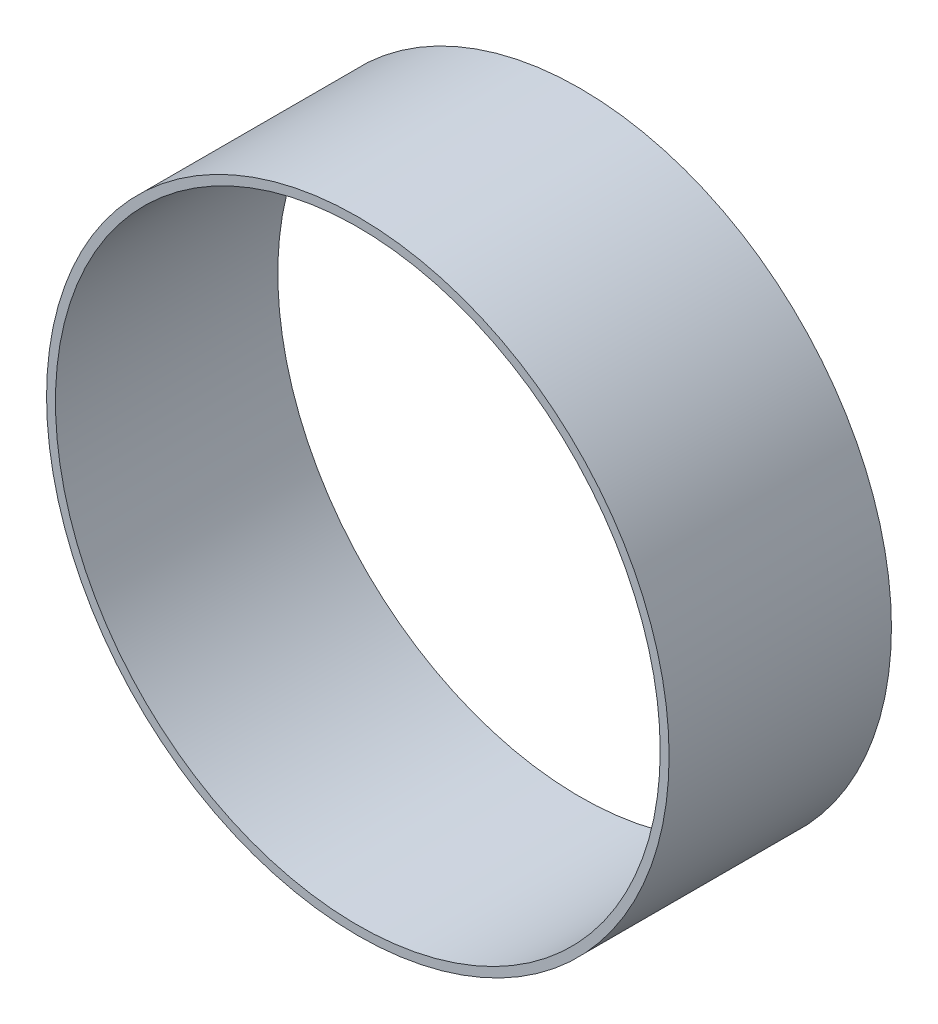
ISO-10303-21;
HEADER;
FILE_DESCRIPTION(('STEP AP214'),'2;1');
FILE_NAME('part.step','',(''),(''),'','','');
FILE_SCHEMA(('AUTOMOTIVE_DESIGN { 1 0 10303 214 1 1 1 1 }'));
ENDSEC;
DATA;
#1=APPLICATION_CONTEXT('core data for automotive mechanical design processes');
#2=APPLICATION_PROTOCOL_DEFINITION('international standard','automotive_design',2000,#1);
#3=PRODUCT_CONTEXT('',#1,'mechanical');
#4=PRODUCT('Part','Part','',(#3));
#5=PRODUCT_RELATED_PRODUCT_CATEGORY('part','',(#4));
#6=PRODUCT_DEFINITION_FORMATION('','',#4);
#7=PRODUCT_DEFINITION_CONTEXT('part definition',#1,'design');
#8=PRODUCT_DEFINITION('design','',#6,#7);
#9=PRODUCT_DEFINITION_SHAPE('','',#8);
#10=(LENGTH_UNIT() NAMED_UNIT(*) SI_UNIT(.MILLI.,.METRE.));
#11=(NAMED_UNIT(*) PLANE_ANGLE_UNIT() SI_UNIT($,.RADIAN.));
#12=(NAMED_UNIT(*) SI_UNIT($,.STERADIAN.) SOLID_ANGLE_UNIT());
#13=UNCERTAINTY_MEASURE_WITH_UNIT(LENGTH_MEASURE(1.E-05),#10,'distance_accuracy_value','');
#14=(GEOMETRIC_REPRESENTATION_CONTEXT(3) GLOBAL_UNCERTAINTY_ASSIGNED_CONTEXT((#13)) GLOBAL_UNIT_ASSIGNED_CONTEXT((#10,
#11,#12)) REPRESENTATION_CONTEXT('',''));
#15=CARTESIAN_POINT('',(0.,0.,0.));
#16=DIRECTION('',(0.,0.,1.));
#17=DIRECTION('',(1.,0.,0.));
#18=AXIS2_PLACEMENT_3D('',#15,#16,#17);
#19=CARTESIAN_POINT('',(0.,0.,0.));
#20=DIRECTION('',(0.,0.,1.));
#21=DIRECTION('',(1.,0.,0.));
#22=AXIS2_PLACEMENT_3D('',#19,#20,#21);
#23=CYLINDRICAL_SURFACE('',#22,68.);
#24=CARTESIAN_POINT('',(0.,0.,-50.));
#25=DIRECTION('',(0.,0.,1.));
#26=DIRECTION('',(1.,0.,0.));
#27=AXIS2_PLACEMENT_3D('',#24,#25,#26);
#28=CIRCLE('',#27,68.);
#29=CARTESIAN_POINT('',(68.,0.,-50.));
#30=VERTEX_POINT('',#29);
#31=EDGE_CURVE('E56',#30,#30,#28,.T.);
#32=ORIENTED_EDGE('',*,*,#31,.F.);
#33=EDGE_LOOP('',(#32));
#34=FACE_BOUND('',#33,.T.);
#35=CARTESIAN_POINT('',(0.,0.,0.));
#36=DIRECTION('',(0.,0.,1.));
#37=DIRECTION('',(1.,0.,0.));
#38=AXIS2_PLACEMENT_3D('',#35,#36,#37);
#39=CIRCLE('',#38,68.);
#40=CARTESIAN_POINT('',(68.,0.,0.));
#41=VERTEX_POINT('',#40);
#42=EDGE_CURVE('E12',#41,#41,#39,.T.);
#43=ORIENTED_EDGE('',*,*,#42,.T.);
#44=EDGE_LOOP('',(#43));
#45=FACE_BOUND('',#44,.T.);
#46=ADVANCED_FACE('F42',(#34,#45),#23,.F.);
#47=CARTESIAN_POINT('',(0.,68.,0.));
#48=DIRECTION('',(0.,0.,-1.));
#49=DIRECTION('',(-1.,0.,0.));
#50=AXIS2_PLACEMENT_3D('',#47,#48,#49);
#51=PLANE('',#50);
#52=ORIENTED_EDGE('',*,*,#42,.F.);
#53=EDGE_LOOP('',(#52));
#54=FACE_BOUND('',#53,.T.);
#55=CARTESIAN_POINT('',(0.,0.,0.));
#56=DIRECTION('',(0.,0.,1.));
#57=DIRECTION('',(1.,0.,0.));
#58=AXIS2_PLACEMENT_3D('',#55,#56,#57);
#59=CIRCLE('',#58,70.);
#60=CARTESIAN_POINT('',(70.,0.,0.));
#61=VERTEX_POINT('',#60);
#62=EDGE_CURVE('E48',#61,#61,#59,.T.);
#63=ORIENTED_EDGE('',*,*,#62,.T.);
#64=EDGE_LOOP('',(#63));
#65=FACE_BOUND('',#64,.T.);
#66=ADVANCED_FACE('F65',(#54,#65),#51,.F.);
#67=CARTESIAN_POINT('',(0.,0.,0.));
#68=DIRECTION('',(0.,0.,1.));
#69=DIRECTION('',(1.,0.,0.));
#70=AXIS2_PLACEMENT_3D('',#67,#68,#69);
#71=CYLINDRICAL_SURFACE('',#70,70.);
#72=ORIENTED_EDGE('',*,*,#62,.F.);
#73=EDGE_LOOP('',(#72));
#74=FACE_BOUND('',#73,.T.);
#75=CARTESIAN_POINT('',(0.,0.,-50.));
#76=DIRECTION('',(0.,0.,1.));
#77=DIRECTION('',(1.,0.,0.));
#78=AXIS2_PLACEMENT_3D('',#75,#76,#77);
#79=CIRCLE('',#78,70.);
#80=CARTESIAN_POINT('',(70.,0.,-50.));
#81=VERTEX_POINT('',#80);
#82=EDGE_CURVE('E52',#81,#81,#79,.T.);
#83=ORIENTED_EDGE('',*,*,#82,.T.);
#84=EDGE_LOOP('',(#83));
#85=FACE_BOUND('',#84,.T.);
#86=ADVANCED_FACE('F69',(#74,#85),#71,.T.);
#87=CARTESIAN_POINT('',(0.,70.,-50.));
#88=DIRECTION('',(0.,0.,1.));
#89=DIRECTION('',(1.,0.,0.));
#90=AXIS2_PLACEMENT_3D('',#87,#88,#89);
#91=PLANE('',#90);
#92=ORIENTED_EDGE('',*,*,#82,.F.);
#93=EDGE_LOOP('',(#92));
#94=FACE_BOUND('',#93,.T.);
#95=ORIENTED_EDGE('',*,*,#31,.T.);
#96=EDGE_LOOP('',(#95));
#97=FACE_BOUND('',#96,.T.);
#98=ADVANCED_FACE('F62',(#94,#97),#91,.F.);
#99=CLOSED_SHELL('',(#46,#66,#86,#98));
#100=MANIFOLD_SOLID_BREP('B2',#99);
#101=ADVANCED_BREP_SHAPE_REPRESENTATION('',(#18,#100),#14);
#102=SHAPE_DEFINITION_REPRESENTATION(#9,#101);
ENDSEC;
END-ISO-10303-21;
